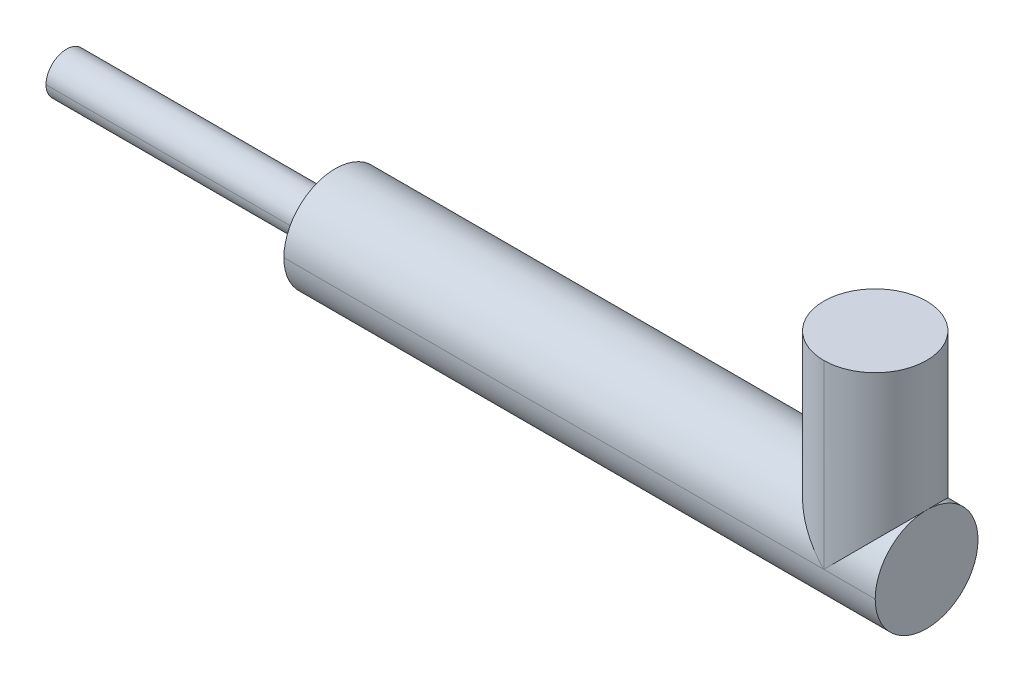
ISO-10303-21;
HEADER;
FILE_DESCRIPTION(('STEP AP214'),'2;1');
FILE_NAME('part.step','',(''),(''),'','','');
FILE_SCHEMA(('AUTOMOTIVE_DESIGN { 1 0 10303 214 1 1 1 1 }'));
ENDSEC;
DATA;
#1=APPLICATION_CONTEXT('core data for automotive mechanical design processes');
#2=APPLICATION_PROTOCOL_DEFINITION('international standard','automotive_design',2000,#1);
#3=PRODUCT_CONTEXT('',#1,'mechanical');
#4=PRODUCT('Part','Part','',(#3));
#5=PRODUCT_RELATED_PRODUCT_CATEGORY('part','',(#4));
#6=PRODUCT_DEFINITION_FORMATION('','',#4);
#7=PRODUCT_DEFINITION_CONTEXT('part definition',#1,'design');
#8=PRODUCT_DEFINITION('design','',#6,#7);
#9=PRODUCT_DEFINITION_SHAPE('','',#8);
#10=(LENGTH_UNIT() NAMED_UNIT(*) SI_UNIT(.MILLI.,.METRE.));
#11=(NAMED_UNIT(*) PLANE_ANGLE_UNIT() SI_UNIT($,.RADIAN.));
#12=(NAMED_UNIT(*) SI_UNIT($,.STERADIAN.) SOLID_ANGLE_UNIT());
#13=UNCERTAINTY_MEASURE_WITH_UNIT(LENGTH_MEASURE(1.E-05),#10,'distance_accuracy_value','');
#14=(GEOMETRIC_REPRESENTATION_CONTEXT(3) GLOBAL_UNCERTAINTY_ASSIGNED_CONTEXT((#13)) GLOBAL_UNIT_ASSIGNED_CONTEXT((#10,
#11,#12)) REPRESENTATION_CONTEXT('',''));
#15=CARTESIAN_POINT('',(0.,0.,0.));
#16=DIRECTION('',(0.,0.,1.));
#17=DIRECTION('',(1.,0.,0.));
#18=AXIS2_PLACEMENT_3D('',#15,#16,#17);
#19=CARTESIAN_POINT('',(393.329488808366,88.,0.));
#20=DIRECTION('',(0.,-1.,0.));
#21=DIRECTION('',(0.,0.,-1.));
#22=AXIS2_PLACEMENT_3D('',#19,#20,#21);
#23=CYLINDRICAL_SURFACE('',#22,25.);
#24=CARTESIAN_POINT('',(393.329488808366,88.,0.));
#25=DIRECTION('',(0.,1.,0.));
#26=DIRECTION('',(0.,0.,1.));
#27=AXIS2_PLACEMENT_3D('',#24,#25,#26);
#28=CIRCLE('',#27,25.);
#29=CARTESIAN_POINT('',(393.329488808366,88.,25.));
#30=VERTEX_POINT('',#29);
#31=CARTESIAN_POINT('',(393.329488808366,88.,-25.));
#32=VERTEX_POINT('',#31);
#33=EDGE_CURVE('E171',#30,#32,#28,.T.);
#34=ORIENTED_EDGE('',*,*,#33,.F.);
#35=DIRECTION('',(0.,-1.,0.));
#36=VECTOR('',#35,1.);
#37=CARTESIAN_POINT('',(393.329488808366,88.,25.));
#38=LINE('',#37,#36);
#39=CARTESIAN_POINT('',(393.329488808366,0.,25.));
#40=VERTEX_POINT('',#39);
#41=EDGE_CURVE('E104',#30,#40,#38,.T.);
#42=ORIENTED_EDGE('',*,*,#41,.T.);
#43=CARTESIAN_POINT('',(393.329488808366,0.,25.));
#44=CARTESIAN_POINT('',(407.974149749039,14.6446609406726,25.));
#45=CARTESIAN_POINT('',(418.329488808367,25.,14.6446609406726));
#46=CARTESIAN_POINT('',(418.329488808367,25.,0.));
#47=(BOUNDED_CURVE() B_SPLINE_CURVE(3,(#43,#44,#45,#46),.UNSPECIFIED.,.F.,
.F.) B_SPLINE_CURVE_WITH_KNOTS((4,4),(1.5707963267949,3.1415926535898),
.UNSPECIFIED.) CURVE() GEOMETRIC_REPRESENTATION_ITEM() RATIONAL_B_SPLINE_CURVE((1.,
0.804737854124365,0.804737854124365,1.)) REPRESENTATION_ITEM(''));
#48=CARTESIAN_POINT('',(418.329488808367,25.,0.));
#49=VERTEX_POINT('',#48);
#50=EDGE_CURVE('E102',#40,#49,#47,.T.);
#51=ORIENTED_EDGE('',*,*,#50,.T.);
#52=CARTESIAN_POINT('',(418.329488808367,25.,0.));
#53=CARTESIAN_POINT('',(418.329488808367,25.,-14.6446609406726));
#54=CARTESIAN_POINT('',(407.974149749039,14.6446609406726,-25.));
#55=CARTESIAN_POINT('',(393.329488808366,0.,-25.));
#56=(BOUNDED_CURVE() B_SPLINE_CURVE(3,(#52,#53,#54,#55),.UNSPECIFIED.,.F.,
.F.) B_SPLINE_CURVE_WITH_KNOTS((4,4),(3.1415926535898,4.71238898038469),
.UNSPECIFIED.) CURVE() GEOMETRIC_REPRESENTATION_ITEM() RATIONAL_B_SPLINE_CURVE((1.,
0.804737854124365,0.804737854124365,1.)) REPRESENTATION_ITEM(''));
#57=CARTESIAN_POINT('',(393.329488808366,0.,-25.));
#58=VERTEX_POINT('',#57);
#59=EDGE_CURVE('E10',#49,#58,#56,.T.);
#60=ORIENTED_EDGE('',*,*,#59,.T.);
#61=DIRECTION('',(0.,-1.,0.));
#62=VECTOR('',#61,1.);
#63=CARTESIAN_POINT('',(393.329488808366,88.,-25.));
#64=LINE('',#63,#62);
#65=EDGE_CURVE('E172',#32,#58,#64,.T.);
#66=ORIENTED_EDGE('',*,*,#65,.F.);
#67=EDGE_LOOP('',(#34,#42,#51,#60,#66));
#68=FACE_BOUND('',#67,.T.);
#69=ADVANCED_FACE('F16',(#68),#23,.T.);
#70=CARTESIAN_POINT('',(0.,0.,0.));
#71=DIRECTION('',(-1.,0.,0.));
#72=DIRECTION('',(0.,0.,1.));
#73=AXIS2_PLACEMENT_3D('',#70,#71,#72);
#74=CYLINDRICAL_SURFACE('',#73,10.);
#75=CARTESIAN_POINT('',(130.7,0.,0.));
#76=DIRECTION('',(1.,0.,0.));
#77=DIRECTION('',(0.,0.,-1.));
#78=AXIS2_PLACEMENT_3D('',#75,#76,#77);
#79=CIRCLE('',#78,10.);
#80=CARTESIAN_POINT('',(130.7,0.,-10.));
#81=VERTEX_POINT('',#80);
#82=CARTESIAN_POINT('',(130.7,0.,10.));
#83=VERTEX_POINT('',#82);
#84=EDGE_CURVE('E122',#81,#83,#79,.T.);
#85=ORIENTED_EDGE('',*,*,#84,.F.);
#86=DIRECTION('',(-1.,0.,0.));
#87=VECTOR('',#86,1.);
#88=CARTESIAN_POINT('',(0.,0.,-10.));
#89=LINE('',#88,#87);
#90=CARTESIAN_POINT('',(0.,0.,-10.));
#91=VERTEX_POINT('',#90);
#92=EDGE_CURVE('E43',#81,#91,#89,.T.);
#93=ORIENTED_EDGE('',*,*,#92,.T.);
#94=CARTESIAN_POINT('',(0.,0.,0.));
#95=DIRECTION('',(-1.,0.,0.));
#96=DIRECTION('',(0.,0.,1.));
#97=AXIS2_PLACEMENT_3D('',#94,#95,#96);
#98=CIRCLE('',#97,10.);
#99=CARTESIAN_POINT('',(0.,0.,10.));
#100=VERTEX_POINT('',#99);
#101=EDGE_CURVE('E118',#100,#91,#98,.T.);
#102=ORIENTED_EDGE('',*,*,#101,.F.);
#103=DIRECTION('',(-1.,0.,0.));
#104=VECTOR('',#103,1.);
#105=CARTESIAN_POINT('',(0.,0.,10.));
#106=LINE('',#105,#104);
#107=EDGE_CURVE('E137',#83,#100,#106,.T.);
#108=ORIENTED_EDGE('',*,*,#107,.F.);
#109=EDGE_LOOP('',(#85,#93,#102,#108));
#110=FACE_BOUND('',#109,.T.);
#111=ADVANCED_FACE('F18',(#110),#74,.T.);
#112=CARTESIAN_POINT('',(418.329488808367,0.,0.));
#113=DIRECTION('',(-1.,0.,0.));
#114=DIRECTION('',(0.,0.,1.));
#115=AXIS2_PLACEMENT_3D('',#112,#113,#114);
#116=CYLINDRICAL_SURFACE('',#115,25.);
#117=CARTESIAN_POINT('',(418.329488808367,0.,0.));
#118=DIRECTION('',(1.,0.,0.));
#119=DIRECTION('',(0.,0.,-1.));
#120=AXIS2_PLACEMENT_3D('',#117,#118,#119);
#121=CIRCLE('',#120,25.);
#122=CARTESIAN_POINT('',(418.329488808367,0.,-25.));
#123=VERTEX_POINT('',#122);
#124=EDGE_CURVE('E94',#123,#49,#121,.T.);
#125=ORIENTED_EDGE('',*,*,#124,.F.);
#126=DIRECTION('',(-1.,0.,0.));
#127=VECTOR('',#126,1.);
#128=CARTESIAN_POINT('',(418.329488808367,0.,-25.));
#129=LINE('',#128,#127);
#130=EDGE_CURVE('E96',#123,#58,#129,.T.);
#131=ORIENTED_EDGE('',*,*,#130,.T.);
#132=ORIENTED_EDGE('',*,*,#59,.F.);
#133=EDGE_LOOP('',(#125,#131,#132));
#134=FACE_BOUND('',#133,.T.);
#135=ADVANCED_FACE('F92',(#134),#116,.T.);
#136=CARTESIAN_POINT('',(418.329488808367,0.,0.));
#137=DIRECTION('',(-1.,0.,0.));
#138=DIRECTION('',(0.,0.,1.));
#139=AXIS2_PLACEMENT_3D('',#136,#137,#138);
#140=CYLINDRICAL_SURFACE('',#139,25.);
#141=CARTESIAN_POINT('',(393.329488808366,0.,-25.));
#142=CARTESIAN_POINT('',(343.329488808366,49.9999999999999,-25.));
#143=CARTESIAN_POINT('',(343.329488808366,49.9999999999999,25.));
#144=CARTESIAN_POINT('',(393.329488808366,0.,25.));
#145=(BOUNDED_CURVE() B_SPLINE_CURVE(3,(#141,#142,#143,#144),.UNSPECIFIED.,.F.,
.F.) B_SPLINE_CURVE_WITH_KNOTS((4,4),(4.71238898038469,7.85398163397448),
.UNSPECIFIED.) CURVE() GEOMETRIC_REPRESENTATION_ITEM() RATIONAL_B_SPLINE_CURVE((1.,
0.333333333333334,0.333333333333334,1.)) REPRESENTATION_ITEM(''));
#146=EDGE_CURVE('E20',#58,#40,#145,.T.);
#147=ORIENTED_EDGE('',*,*,#146,.F.);
#148=DIRECTION('',(-1.,0.,0.));
#149=VECTOR('',#148,1.);
#150=CARTESIAN_POINT('',(418.329488808367,0.,-25.));
#151=LINE('',#150,#149);
#152=CARTESIAN_POINT('',(130.7,0.,-25.));
#153=VERTEX_POINT('',#152);
#154=EDGE_CURVE('E29',#58,#153,#151,.T.);
#155=ORIENTED_EDGE('',*,*,#154,.T.);
#156=CARTESIAN_POINT('',(130.7,0.,0.));
#157=DIRECTION('',(1.,0.,0.));
#158=DIRECTION('',(0.,0.,-1.));
#159=AXIS2_PLACEMENT_3D('',#156,#157,#158);
#160=CIRCLE('',#159,25.);
#161=CARTESIAN_POINT('',(130.7,0.,25.));
#162=VERTEX_POINT('',#161);
#163=EDGE_CURVE('E157',#153,#162,#160,.T.);
#164=ORIENTED_EDGE('',*,*,#163,.T.);
#165=DIRECTION('',(-1.,0.,0.));
#166=VECTOR('',#165,1.);
#167=CARTESIAN_POINT('',(418.329488808367,0.,25.));
#168=LINE('',#167,#166);
#169=EDGE_CURVE('E160',#40,#162,#168,.T.);
#170=ORIENTED_EDGE('',*,*,#169,.F.);
#171=EDGE_LOOP('',(#147,#155,#164,#170));
#172=FACE_BOUND('',#171,.T.);
#173=ADVANCED_FACE('F287',(#172),#140,.T.);
#174=CARTESIAN_POINT('',(418.329488808367,0.,0.));
#175=DIRECTION('',(-1.,0.,0.));
#176=DIRECTION('',(0.,0.,1.));
#177=AXIS2_PLACEMENT_3D('',#174,#175,#176);
#178=CYLINDRICAL_SURFACE('',#177,25.);
#179=ORIENTED_EDGE('',*,*,#130,.F.);
#180=CARTESIAN_POINT('',(418.329488808367,0.,0.));
#181=DIRECTION('',(1.,0.,0.));
#182=DIRECTION('',(0.,0.,-1.));
#183=AXIS2_PLACEMENT_3D('',#180,#181,#182);
#184=CIRCLE('',#183,25.);
#185=CARTESIAN_POINT('',(418.329488808367,0.,25.));
#186=VERTEX_POINT('',#185);
#187=EDGE_CURVE('E116',#186,#123,#184,.T.);
#188=ORIENTED_EDGE('',*,*,#187,.F.);
#189=DIRECTION('',(-1.,0.,0.));
#190=VECTOR('',#189,1.);
#191=CARTESIAN_POINT('',(418.329488808367,0.,25.));
#192=LINE('',#191,#190);
#193=EDGE_CURVE('E109',#186,#40,#192,.T.);
#194=ORIENTED_EDGE('',*,*,#193,.T.);
#195=ORIENTED_EDGE('',*,*,#169,.T.);
#196=CARTESIAN_POINT('',(130.7,0.,0.));
#197=DIRECTION('',(1.,0.,0.));
#198=DIRECTION('',(0.,0.,-1.));
#199=AXIS2_PLACEMENT_3D('',#196,#197,#198);
#200=CIRCLE('',#199,25.);
#201=EDGE_CURVE('E154',#162,#153,#200,.T.);
#202=ORIENTED_EDGE('',*,*,#201,.T.);
#203=ORIENTED_EDGE('',*,*,#154,.F.);
#204=EDGE_LOOP('',(#179,#188,#194,#195,#202,#203));
#205=FACE_BOUND('',#204,.T.);
#206=ADVANCED_FACE('F283',(#205),#178,.T.);
#207=CARTESIAN_POINT('',(418.329488808367,0.,0.));
#208=DIRECTION('',(-1.,0.,0.));
#209=DIRECTION('',(0.,0.,1.));
#210=AXIS2_PLACEMENT_3D('',#207,#208,#209);
#211=CYLINDRICAL_SURFACE('',#210,25.);
#212=ORIENTED_EDGE('',*,*,#193,.F.);
#213=CARTESIAN_POINT('',(418.329488808367,0.,0.));
#214=DIRECTION('',(1.,0.,0.));
#215=DIRECTION('',(0.,0.,-1.));
#216=AXIS2_PLACEMENT_3D('',#213,#214,#215);
#217=CIRCLE('',#216,25.);
#218=EDGE_CURVE('E114',#49,#186,#217,.T.);
#219=ORIENTED_EDGE('',*,*,#218,.F.);
#220=ORIENTED_EDGE('',*,*,#50,.F.);
#221=EDGE_LOOP('',(#212,#219,#220));
#222=FACE_BOUND('',#221,.T.);
#223=ADVANCED_FACE('F120',(#222),#211,.T.);
#224=CARTESIAN_POINT('',(0.,0.,0.));
#225=DIRECTION('',(-1.,0.,0.));
#226=DIRECTION('',(0.,0.,1.));
#227=AXIS2_PLACEMENT_3D('',#224,#225,#226);
#228=CYLINDRICAL_SURFACE('',#227,10.);
#229=ORIENTED_EDGE('',*,*,#92,.F.);
#230=CARTESIAN_POINT('',(130.7,0.,0.));
#231=DIRECTION('',(1.,0.,0.));
#232=DIRECTION('',(0.,0.,-1.));
#233=AXIS2_PLACEMENT_3D('',#230,#231,#232);
#234=CIRCLE('',#233,10.);
#235=EDGE_CURVE('E132',#83,#81,#234,.T.);
#236=ORIENTED_EDGE('',*,*,#235,.F.);
#237=ORIENTED_EDGE('',*,*,#107,.T.);
#238=CARTESIAN_POINT('',(0.,0.,0.));
#239=DIRECTION('',(-1.,0.,0.));
#240=DIRECTION('',(0.,0.,1.));
#241=AXIS2_PLACEMENT_3D('',#238,#239,#240);
#242=CIRCLE('',#241,10.);
#243=EDGE_CURVE('E140',#91,#100,#242,.T.);
#244=ORIENTED_EDGE('',*,*,#243,.F.);
#245=EDGE_LOOP('',(#229,#236,#237,#244));
#246=FACE_BOUND('',#245,.T.);
#247=ADVANCED_FACE('F267',(#246),#228,.T.);
#248=CARTESIAN_POINT('',(0.,0.,0.));
#249=DIRECTION('',(1.,0.,0.));
#250=DIRECTION('',(0.,1.,0.));
#251=AXIS2_PLACEMENT_3D('',#248,#249,#250);
#252=PLANE('',#251);
#253=ORIENTED_EDGE('',*,*,#101,.T.);
#254=ORIENTED_EDGE('',*,*,#243,.T.);
#255=EDGE_LOOP('',(#253,#254));
#256=FACE_BOUND('',#255,.T.);
#257=ADVANCED_FACE('F263',(#256),#252,.F.);
#258=CARTESIAN_POINT('',(418.329488808367,0.,0.));
#259=DIRECTION('',(1.,0.,0.));
#260=DIRECTION('',(0.,1.,0.));
#261=AXIS2_PLACEMENT_3D('',#258,#259,#260);
#262=PLANE('',#261);
#263=ORIENTED_EDGE('',*,*,#218,.T.);
#264=ORIENTED_EDGE('',*,*,#187,.T.);
#265=ORIENTED_EDGE('',*,*,#124,.T.);
#266=EDGE_LOOP('',(#263,#264,#265));
#267=FACE_BOUND('',#266,.T.);
#268=ADVANCED_FACE('F113',(#267),#262,.T.);
#269=CARTESIAN_POINT('',(130.7,0.,0.));
#270=DIRECTION('',(1.,0.,0.));
#271=DIRECTION('',(0.,1.,0.));
#272=AXIS2_PLACEMENT_3D('',#269,#270,#271);
#273=PLANE('',#272);
#274=ORIENTED_EDGE('',*,*,#235,.T.);
#275=ORIENTED_EDGE('',*,*,#84,.T.);
#276=EDGE_LOOP('',(#274,#275));
#277=FACE_BOUND('',#276,.T.);
#278=ORIENTED_EDGE('',*,*,#201,.F.);
#279=ORIENTED_EDGE('',*,*,#163,.F.);
#280=EDGE_LOOP('',(#278,#279));
#281=FACE_BOUND('',#280,.T.);
#282=ADVANCED_FACE('F277',(#277,#281),#273,.F.);
#283=CARTESIAN_POINT('',(393.329488808366,88.,0.));
#284=DIRECTION('',(0.,-1.,0.));
#285=DIRECTION('',(0.,0.,-1.));
#286=AXIS2_PLACEMENT_3D('',#283,#284,#285);
#287=CYLINDRICAL_SURFACE('',#286,25.);
#288=ORIENTED_EDGE('',*,*,#41,.F.);
#289=CARTESIAN_POINT('',(393.329488808366,88.,0.));
#290=DIRECTION('',(0.,1.,0.));
#291=DIRECTION('',(0.,0.,1.));
#292=AXIS2_PLACEMENT_3D('',#289,#290,#291);
#293=CIRCLE('',#292,25.);
#294=EDGE_CURVE('E167',#32,#30,#293,.T.);
#295=ORIENTED_EDGE('',*,*,#294,.F.);
#296=ORIENTED_EDGE('',*,*,#65,.T.);
#297=ORIENTED_EDGE('',*,*,#146,.T.);
#298=EDGE_LOOP('',(#288,#295,#296,#297));
#299=FACE_BOUND('',#298,.T.);
#300=ADVANCED_FACE('F272',(#299),#287,.T.);
#301=CARTESIAN_POINT('',(393.329488808366,88.,0.));
#302=DIRECTION('',(0.,1.,0.));
#303=DIRECTION('',(1.,0.,0.));
#304=AXIS2_PLACEMENT_3D('',#301,#302,#303);
#305=PLANE('',#304);
#306=ORIENTED_EDGE('',*,*,#294,.T.);
#307=ORIENTED_EDGE('',*,*,#33,.T.);
#308=EDGE_LOOP('',(#306,#307));
#309=FACE_BOUND('',#308,.T.);
#310=ADVANCED_FACE('F276',(#309),#305,.T.);
#311=CLOSED_SHELL('',(#69,#111,#135,#173,#206,#223,#247,#257,#268,#282,#300,#310));
#312=MANIFOLD_SOLID_BREP('B1',#311);
#313=ADVANCED_BREP_SHAPE_REPRESENTATION('',(#18,#312),#14);
#314=SHAPE_DEFINITION_REPRESENTATION(#9,#313);
ENDSEC;
END-ISO-10303-21;
